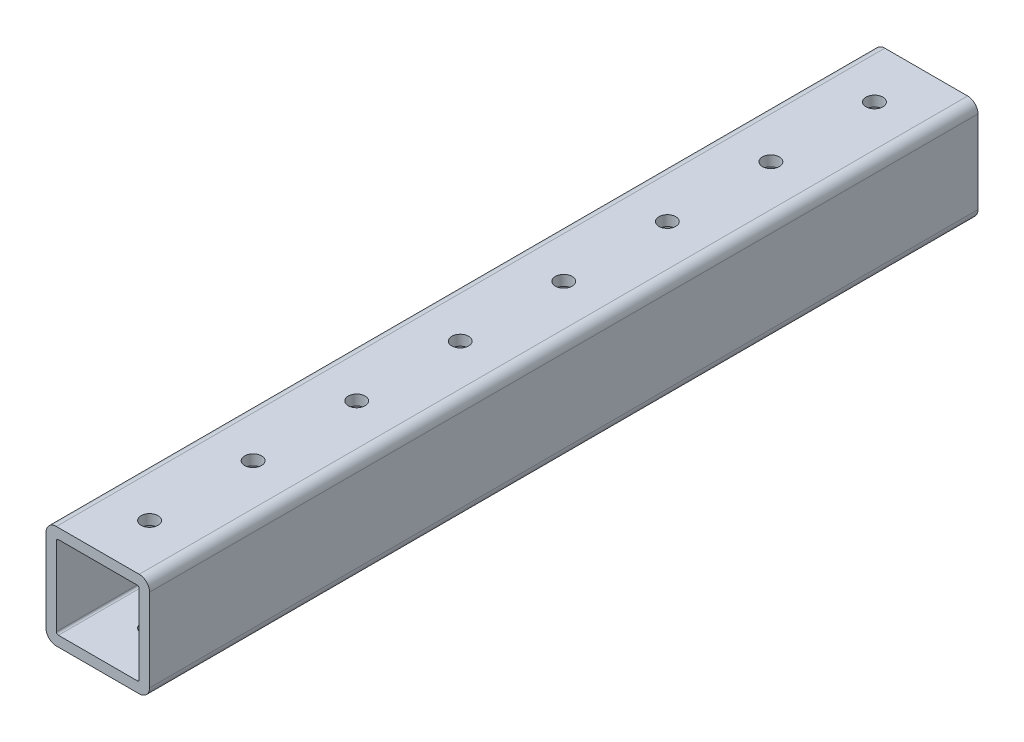
ISO-10303-21;
HEADER;
FILE_DESCRIPTION(('STEP AP214'),'2;1');
FILE_NAME('part.step','',(''),(''),'','','');
FILE_SCHEMA(('AUTOMOTIVE_DESIGN { 1 0 10303 214 1 1 1 1 }'));
ENDSEC;
DATA;
#1=APPLICATION_CONTEXT('core data for automotive mechanical design processes');
#2=APPLICATION_PROTOCOL_DEFINITION('international standard','automotive_design',2000,#1);
#3=PRODUCT_CONTEXT('',#1,'mechanical');
#4=PRODUCT('Part','Part','',(#3));
#5=PRODUCT_RELATED_PRODUCT_CATEGORY('part','',(#4));
#6=PRODUCT_DEFINITION_FORMATION('','',#4);
#7=PRODUCT_DEFINITION_CONTEXT('part definition',#1,'design');
#8=PRODUCT_DEFINITION('design','',#6,#7);
#9=PRODUCT_DEFINITION_SHAPE('','',#8);
#10=(LENGTH_UNIT() NAMED_UNIT(*) SI_UNIT(.MILLI.,.METRE.));
#11=(NAMED_UNIT(*) PLANE_ANGLE_UNIT() SI_UNIT($,.RADIAN.));
#12=(NAMED_UNIT(*) SI_UNIT($,.STERADIAN.) SOLID_ANGLE_UNIT());
#13=UNCERTAINTY_MEASURE_WITH_UNIT(LENGTH_MEASURE(1.E-05),#10,'distance_accuracy_value','');
#14=(GEOMETRIC_REPRESENTATION_CONTEXT(3) GLOBAL_UNCERTAINTY_ASSIGNED_CONTEXT((#13)) GLOBAL_UNIT_ASSIGNED_CONTEXT((#10,
#11,#12)) REPRESENTATION_CONTEXT('',''));
#15=CARTESIAN_POINT('',(0.,0.,0.));
#16=DIRECTION('',(0.,0.,1.));
#17=DIRECTION('',(1.,0.,0.));
#18=AXIS2_PLACEMENT_3D('',#15,#16,#17);
#19=CARTESIAN_POINT('',(-9.65999999999999,9.66,749.3));
#20=DIRECTION('',(0.,0.,1.));
#21=DIRECTION('',(1.,0.,0.));
#22=AXIS2_PLACEMENT_3D('',#19,#20,#21);
#23=CYLINDRICAL_SURFACE('',#22,0.5);
#24=DIRECTION('',(0.,0.,-1.));
#25=VECTOR('',#24,1.);
#26=CARTESIAN_POINT('',(-10.16,9.66,749.3));
#27=LINE('',#26,#25);
#28=CARTESIAN_POINT('',(-10.16,9.66,546.1));
#29=VERTEX_POINT('',#28);
#30=CARTESIAN_POINT('',(-10.16,9.66,749.3));
#31=VERTEX_POINT('',#30);
#32=EDGE_CURVE('E192',#29,#31,#27,.F.);
#33=ORIENTED_EDGE('',*,*,#32,.F.);
#34=CARTESIAN_POINT('',(-9.65999999999999,9.66,546.1));
#35=DIRECTION('',(0.,0.,1.));
#36=DIRECTION('',(1.,0.,0.));
#37=AXIS2_PLACEMENT_3D('',#34,#35,#36);
#38=CIRCLE('',#37,0.5);
#39=CARTESIAN_POINT('',(-9.65999999999999,10.16,546.1));
#40=VERTEX_POINT('',#39);
#41=EDGE_CURVE('E334',#29,#40,#38,.F.);
#42=ORIENTED_EDGE('',*,*,#41,.T.);
#43=DIRECTION('',(0.,0.,-1.));
#44=VECTOR('',#43,1.);
#45=CARTESIAN_POINT('',(-9.65999999999999,10.16,749.3));
#46=LINE('',#45,#44);
#47=CARTESIAN_POINT('',(-9.65999999999999,10.16,749.3));
#48=VERTEX_POINT('',#47);
#49=EDGE_CURVE('E270',#48,#40,#46,.T.);
#50=ORIENTED_EDGE('',*,*,#49,.F.);
#51=CARTESIAN_POINT('',(-9.65999999999999,9.66,749.3));
#52=DIRECTION('',(0.,0.,1.));
#53=DIRECTION('',(1.,0.,0.));
#54=AXIS2_PLACEMENT_3D('',#51,#52,#53);
#55=CIRCLE('',#54,0.5);
#56=EDGE_CURVE('E329',#31,#48,#55,.F.);
#57=ORIENTED_EDGE('',*,*,#56,.F.);
#58=EDGE_LOOP('',(#33,#42,#50,#57));
#59=FACE_BOUND('',#58,.T.);
#60=ADVANCED_FACE('F32',(#59),#23,.F.);
#61=CARTESIAN_POINT('',(0.,-12.7,558.8));
#62=DIRECTION('',(0.,1.,0.));
#63=DIRECTION('',(0.,0.,1.));
#64=AXIS2_PLACEMENT_3D('',#61,#62,#63);
#65=CYLINDRICAL_SURFACE('',#64,2.07009999999996);
#66=CARTESIAN_POINT('',(0.,10.16,558.8));
#67=DIRECTION('',(0.,1.,0.));
#68=DIRECTION('',(0.,0.,1.));
#69=AXIS2_PLACEMENT_3D('',#66,#67,#68);
#70=CIRCLE('',#69,2.07009999999996);
#71=CARTESIAN_POINT('',(0.,10.16,560.8701));
#72=VERTEX_POINT('',#71);
#73=EDGE_CURVE('E267',#72,#72,#70,.T.);
#74=ORIENTED_EDGE('',*,*,#73,.F.);
#75=EDGE_LOOP('',(#74));
#76=FACE_BOUND('',#75,.T.);
#77=CARTESIAN_POINT('',(0.,12.7,558.8));
#78=DIRECTION('',(0.,1.,0.));
#79=DIRECTION('',(0.,0.,1.));
#80=AXIS2_PLACEMENT_3D('',#77,#78,#79);
#81=CIRCLE('',#80,2.07009999999996);
#82=CARTESIAN_POINT('',(0.,12.7,560.8701));
#83=VERTEX_POINT('',#82);
#84=EDGE_CURVE('E321',#83,#83,#81,.T.);
#85=ORIENTED_EDGE('',*,*,#84,.T.);
#86=EDGE_LOOP('',(#85));
#87=FACE_BOUND('',#86,.T.);
#88=ADVANCED_FACE('F408',(#76,#87),#65,.F.);
#89=CARTESIAN_POINT('',(0.,-12.7,584.2));
#90=DIRECTION('',(0.,1.,0.));
#91=DIRECTION('',(0.,0.,1.));
#92=AXIS2_PLACEMENT_3D('',#89,#90,#91);
#93=CYLINDRICAL_SURFACE('',#92,2.07009999999996);
#94=CARTESIAN_POINT('',(0.,10.16,584.2));
#95=DIRECTION('',(0.,1.,0.));
#96=DIRECTION('',(0.,0.,1.));
#97=AXIS2_PLACEMENT_3D('',#94,#95,#96);
#98=CIRCLE('',#97,2.07009999999996);
#99=CARTESIAN_POINT('',(0.,10.16,586.2701));
#100=VERTEX_POINT('',#99);
#101=EDGE_CURVE('E264',#100,#100,#98,.T.);
#102=ORIENTED_EDGE('',*,*,#101,.F.);
#103=EDGE_LOOP('',(#102));
#104=FACE_BOUND('',#103,.T.);
#105=CARTESIAN_POINT('',(0.,12.7,584.2));
#106=DIRECTION('',(0.,1.,0.));
#107=DIRECTION('',(0.,0.,1.));
#108=AXIS2_PLACEMENT_3D('',#105,#106,#107);
#109=CIRCLE('',#108,2.07009999999996);
#110=CARTESIAN_POINT('',(0.,12.7,586.2701));
#111=VERTEX_POINT('',#110);
#112=EDGE_CURVE('E318',#111,#111,#109,.T.);
#113=ORIENTED_EDGE('',*,*,#112,.T.);
#114=EDGE_LOOP('',(#113));
#115=FACE_BOUND('',#114,.T.);
#116=ADVANCED_FACE('F413',(#104,#115),#93,.F.);
#117=CARTESIAN_POINT('',(0.,-12.7,609.6));
#118=DIRECTION('',(0.,1.,0.));
#119=DIRECTION('',(0.,0.,1.));
#120=AXIS2_PLACEMENT_3D('',#117,#118,#119);
#121=CYLINDRICAL_SURFACE('',#120,2.07009999999996);
#122=CARTESIAN_POINT('',(0.,10.16,609.6));
#123=DIRECTION('',(0.,1.,0.));
#124=DIRECTION('',(0.,0.,1.));
#125=AXIS2_PLACEMENT_3D('',#122,#123,#124);
#126=CIRCLE('',#125,2.07009999999996);
#127=CARTESIAN_POINT('',(0.,10.16,611.6701));
#128=VERTEX_POINT('',#127);
#129=EDGE_CURVE('E261',#128,#128,#126,.T.);
#130=ORIENTED_EDGE('',*,*,#129,.F.);
#131=EDGE_LOOP('',(#130));
#132=FACE_BOUND('',#131,.T.);
#133=CARTESIAN_POINT('',(0.,12.7,609.6));
#134=DIRECTION('',(0.,1.,0.));
#135=DIRECTION('',(0.,0.,1.));
#136=AXIS2_PLACEMENT_3D('',#133,#134,#135);
#137=CIRCLE('',#136,2.07009999999996);
#138=CARTESIAN_POINT('',(0.,12.7,611.6701));
#139=VERTEX_POINT('',#138);
#140=EDGE_CURVE('E315',#139,#139,#137,.T.);
#141=ORIENTED_EDGE('',*,*,#140,.T.);
#142=EDGE_LOOP('',(#141));
#143=FACE_BOUND('',#142,.T.);
#144=ADVANCED_FACE('F534',(#132,#143),#121,.F.);
#145=CARTESIAN_POINT('',(0.,-12.7,635.));
#146=DIRECTION('',(0.,1.,0.));
#147=DIRECTION('',(0.,0.,1.));
#148=AXIS2_PLACEMENT_3D('',#145,#146,#147);
#149=CYLINDRICAL_SURFACE('',#148,2.07009999999996);
#150=CARTESIAN_POINT('',(0.,10.16,635.));
#151=DIRECTION('',(0.,1.,0.));
#152=DIRECTION('',(0.,0.,1.));
#153=AXIS2_PLACEMENT_3D('',#150,#151,#152);
#154=CIRCLE('',#153,2.07009999999996);
#155=CARTESIAN_POINT('',(0.,10.16,637.0701));
#156=VERTEX_POINT('',#155);
#157=EDGE_CURVE('E258',#156,#156,#154,.T.);
#158=ORIENTED_EDGE('',*,*,#157,.F.);
#159=EDGE_LOOP('',(#158));
#160=FACE_BOUND('',#159,.T.);
#161=CARTESIAN_POINT('',(0.,12.7,635.));
#162=DIRECTION('',(0.,1.,0.));
#163=DIRECTION('',(0.,0.,1.));
#164=AXIS2_PLACEMENT_3D('',#161,#162,#163);
#165=CIRCLE('',#164,2.07009999999996);
#166=CARTESIAN_POINT('',(0.,12.7,637.0701));
#167=VERTEX_POINT('',#166);
#168=EDGE_CURVE('E312',#167,#167,#165,.T.);
#169=ORIENTED_EDGE('',*,*,#168,.T.);
#170=EDGE_LOOP('',(#169));
#171=FACE_BOUND('',#170,.T.);
#172=ADVANCED_FACE('F530',(#160,#171),#149,.F.);
#173=CARTESIAN_POINT('',(0.,-12.7,660.4));
#174=DIRECTION('',(0.,1.,0.));
#175=DIRECTION('',(0.,0.,1.));
#176=AXIS2_PLACEMENT_3D('',#173,#174,#175);
#177=CYLINDRICAL_SURFACE('',#176,2.07009999999996);
#178=CARTESIAN_POINT('',(0.,10.16,660.4));
#179=DIRECTION('',(0.,1.,0.));
#180=DIRECTION('',(0.,0.,1.));
#181=AXIS2_PLACEMENT_3D('',#178,#179,#180);
#182=CIRCLE('',#181,2.07009999999996);
#183=CARTESIAN_POINT('',(0.,10.16,662.4701));
#184=VERTEX_POINT('',#183);
#185=EDGE_CURVE('E255',#184,#184,#182,.T.);
#186=ORIENTED_EDGE('',*,*,#185,.F.);
#187=EDGE_LOOP('',(#186));
#188=FACE_BOUND('',#187,.T.);
#189=CARTESIAN_POINT('',(0.,12.7,660.4));
#190=DIRECTION('',(0.,1.,0.));
#191=DIRECTION('',(0.,0.,1.));
#192=AXIS2_PLACEMENT_3D('',#189,#190,#191);
#193=CIRCLE('',#192,2.07009999999996);
#194=CARTESIAN_POINT('',(0.,12.7,662.4701));
#195=VERTEX_POINT('',#194);
#196=EDGE_CURVE('E309',#195,#195,#193,.T.);
#197=ORIENTED_EDGE('',*,*,#196,.T.);
#198=EDGE_LOOP('',(#197));
#199=FACE_BOUND('',#198,.T.);
#200=ADVANCED_FACE('F526',(#188,#199),#177,.F.);
#201=CARTESIAN_POINT('',(0.,-12.7,685.8));
#202=DIRECTION('',(0.,1.,0.));
#203=DIRECTION('',(0.,0.,1.));
#204=AXIS2_PLACEMENT_3D('',#201,#202,#203);
#205=CYLINDRICAL_SURFACE('',#204,2.07009999999996);
#206=CARTESIAN_POINT('',(0.,10.16,685.8));
#207=DIRECTION('',(0.,1.,0.));
#208=DIRECTION('',(0.,0.,1.));
#209=AXIS2_PLACEMENT_3D('',#206,#207,#208);
#210=CIRCLE('',#209,2.07009999999996);
#211=CARTESIAN_POINT('',(0.,10.16,687.8701));
#212=VERTEX_POINT('',#211);
#213=EDGE_CURVE('E252',#212,#212,#210,.T.);
#214=ORIENTED_EDGE('',*,*,#213,.F.);
#215=EDGE_LOOP('',(#214));
#216=FACE_BOUND('',#215,.T.);
#217=CARTESIAN_POINT('',(0.,12.7,685.8));
#218=DIRECTION('',(0.,1.,0.));
#219=DIRECTION('',(0.,0.,1.));
#220=AXIS2_PLACEMENT_3D('',#217,#218,#219);
#221=CIRCLE('',#220,2.07009999999996);
#222=CARTESIAN_POINT('',(0.,12.7,687.8701));
#223=VERTEX_POINT('',#222);
#224=EDGE_CURVE('E306',#223,#223,#221,.T.);
#225=ORIENTED_EDGE('',*,*,#224,.T.);
#226=EDGE_LOOP('',(#225));
#227=FACE_BOUND('',#226,.T.);
#228=ADVANCED_FACE('F522',(#216,#227),#205,.F.);
#229=CARTESIAN_POINT('',(0.,-12.7,711.2));
#230=DIRECTION('',(0.,1.,0.));
#231=DIRECTION('',(0.,0.,1.));
#232=AXIS2_PLACEMENT_3D('',#229,#230,#231);
#233=CYLINDRICAL_SURFACE('',#232,2.07009999999996);
#234=CARTESIAN_POINT('',(0.,10.16,711.2));
#235=DIRECTION('',(0.,1.,0.));
#236=DIRECTION('',(0.,0.,1.));
#237=AXIS2_PLACEMENT_3D('',#234,#235,#236);
#238=CIRCLE('',#237,2.07009999999996);
#239=CARTESIAN_POINT('',(0.,10.16,713.2701));
#240=VERTEX_POINT('',#239);
#241=EDGE_CURVE('E249',#240,#240,#238,.T.);
#242=ORIENTED_EDGE('',*,*,#241,.F.);
#243=EDGE_LOOP('',(#242));
#244=FACE_BOUND('',#243,.T.);
#245=CARTESIAN_POINT('',(0.,12.7,711.2));
#246=DIRECTION('',(0.,1.,0.));
#247=DIRECTION('',(0.,0.,1.));
#248=AXIS2_PLACEMENT_3D('',#245,#246,#247);
#249=CIRCLE('',#248,2.07009999999996);
#250=CARTESIAN_POINT('',(0.,12.7,713.2701));
#251=VERTEX_POINT('',#250);
#252=EDGE_CURVE('E303',#251,#251,#249,.T.);
#253=ORIENTED_EDGE('',*,*,#252,.T.);
#254=EDGE_LOOP('',(#253));
#255=FACE_BOUND('',#254,.T.);
#256=ADVANCED_FACE('F518',(#244,#255),#233,.F.);
#257=CARTESIAN_POINT('',(0.,-12.7,736.6));
#258=DIRECTION('',(0.,1.,0.));
#259=DIRECTION('',(0.,0.,1.));
#260=AXIS2_PLACEMENT_3D('',#257,#258,#259);
#261=CYLINDRICAL_SURFACE('',#260,2.07009999999996);
#262=CARTESIAN_POINT('',(0.,10.16,736.6));
#263=DIRECTION('',(0.,1.,0.));
#264=DIRECTION('',(0.,0.,1.));
#265=AXIS2_PLACEMENT_3D('',#262,#263,#264);
#266=CIRCLE('',#265,2.07009999999996);
#267=CARTESIAN_POINT('',(0.,10.16,738.6701));
#268=VERTEX_POINT('',#267);
#269=EDGE_CURVE('E185',#268,#268,#266,.T.);
#270=ORIENTED_EDGE('',*,*,#269,.F.);
#271=EDGE_LOOP('',(#270));
#272=FACE_BOUND('',#271,.T.);
#273=CARTESIAN_POINT('',(0.,12.7,736.6));
#274=DIRECTION('',(0.,1.,0.));
#275=DIRECTION('',(0.,0.,1.));
#276=AXIS2_PLACEMENT_3D('',#273,#274,#275);
#277=CIRCLE('',#276,2.07009999999996);
#278=CARTESIAN_POINT('',(0.,12.7,738.6701));
#279=VERTEX_POINT('',#278);
#280=EDGE_CURVE('E300',#279,#279,#277,.T.);
#281=ORIENTED_EDGE('',*,*,#280,.T.);
#282=EDGE_LOOP('',(#281));
#283=FACE_BOUND('',#282,.T.);
#284=ADVANCED_FACE('F515',(#272,#283),#261,.F.);
#285=CARTESIAN_POINT('',(9.66,9.65999999999999,749.3));
#286=DIRECTION('',(0.,0.,1.));
#287=DIRECTION('',(1.,0.,0.));
#288=AXIS2_PLACEMENT_3D('',#285,#286,#287);
#289=CYLINDRICAL_SURFACE('',#288,0.5);
#290=DIRECTION('',(0.,0.,-1.));
#291=VECTOR('',#290,1.);
#292=CARTESIAN_POINT('',(9.66,10.16,749.3));
#293=LINE('',#292,#291);
#294=CARTESIAN_POINT('',(9.66,10.16,546.1));
#295=VERTEX_POINT('',#294);
#296=CARTESIAN_POINT('',(9.66,10.16,749.3));
#297=VERTEX_POINT('',#296);
#298=EDGE_CURVE('E191',#295,#297,#293,.F.);
#299=ORIENTED_EDGE('',*,*,#298,.F.);
#300=CARTESIAN_POINT('',(9.66,9.65999999999999,546.1));
#301=DIRECTION('',(0.,0.,1.));
#302=DIRECTION('',(1.,0.,0.));
#303=AXIS2_PLACEMENT_3D('',#300,#301,#302);
#304=CIRCLE('',#303,0.5);
#305=CARTESIAN_POINT('',(10.16,9.65999999999999,546.1));
#306=VERTEX_POINT('',#305);
#307=EDGE_CURVE('E337',#295,#306,#304,.F.);
#308=ORIENTED_EDGE('',*,*,#307,.T.);
#309=DIRECTION('',(0.,0.,1.));
#310=VECTOR('',#309,1.);
#311=CARTESIAN_POINT('',(10.16,9.65999999999999,749.3));
#312=LINE('',#311,#310);
#313=CARTESIAN_POINT('',(10.16,9.65999999999999,749.3));
#314=VERTEX_POINT('',#313);
#315=EDGE_CURVE('E181',#314,#306,#312,.F.);
#316=ORIENTED_EDGE('',*,*,#315,.F.);
#317=CARTESIAN_POINT('',(9.66,9.65999999999999,749.3));
#318=DIRECTION('',(0.,0.,1.));
#319=DIRECTION('',(1.,0.,0.));
#320=AXIS2_PLACEMENT_3D('',#317,#318,#319);
#321=CIRCLE('',#320,0.5);
#322=EDGE_CURVE('E328',#297,#314,#321,.F.);
#323=ORIENTED_EDGE('',*,*,#322,.F.);
#324=EDGE_LOOP('',(#299,#308,#316,#323));
#325=FACE_BOUND('',#324,.T.);
#326=ADVANCED_FACE('F440',(#325),#289,.F.);
#327=CARTESIAN_POINT('',(-9.65999999999999,-9.66,749.3));
#328=DIRECTION('',(0.,0.,1.));
#329=DIRECTION('',(1.,0.,0.));
#330=AXIS2_PLACEMENT_3D('',#327,#328,#329);
#331=CYLINDRICAL_SURFACE('',#330,0.5);
#332=DIRECTION('',(0.,0.,1.));
#333=VECTOR('',#332,1.);
#334=CARTESIAN_POINT('',(-9.65999999999999,-10.16,749.3));
#335=LINE('',#334,#333);
#336=CARTESIAN_POINT('',(-9.65999999999999,-10.16,546.1));
#337=VERTEX_POINT('',#336);
#338=CARTESIAN_POINT('',(-9.65999999999999,-10.16,749.3));
#339=VERTEX_POINT('',#338);
#340=EDGE_CURVE('E187',#337,#339,#335,.T.);
#341=ORIENTED_EDGE('',*,*,#340,.F.);
#342=CARTESIAN_POINT('',(-9.65999999999999,-9.66,546.1));
#343=DIRECTION('',(0.,0.,1.));
#344=DIRECTION('',(1.,0.,0.));
#345=AXIS2_PLACEMENT_3D('',#342,#343,#344);
#346=CIRCLE('',#345,0.5);
#347=CARTESIAN_POINT('',(-10.16,-9.66,546.1));
#348=VERTEX_POINT('',#347);
#349=EDGE_CURVE('E46',#337,#348,#346,.F.);
#350=ORIENTED_EDGE('',*,*,#349,.T.);
#351=DIRECTION('',(0.,0.,-1.));
#352=VECTOR('',#351,1.);
#353=CARTESIAN_POINT('',(-10.16,-9.66,749.3));
#354=LINE('',#353,#352);
#355=CARTESIAN_POINT('',(-10.16,-9.66,749.3));
#356=VERTEX_POINT('',#355);
#357=EDGE_CURVE('E188',#356,#348,#354,.T.);
#358=ORIENTED_EDGE('',*,*,#357,.F.);
#359=CARTESIAN_POINT('',(-9.65999999999999,-9.66,749.3));
#360=DIRECTION('',(0.,0.,1.));
#361=DIRECTION('',(1.,0.,0.));
#362=AXIS2_PLACEMENT_3D('',#359,#360,#361);
#363=CIRCLE('',#362,0.5);
#364=EDGE_CURVE('E326',#339,#356,#363,.F.);
#365=ORIENTED_EDGE('',*,*,#364,.F.);
#366=EDGE_LOOP('',(#341,#350,#358,#365));
#367=FACE_BOUND('',#366,.T.);
#368=ADVANCED_FACE('F423',(#367),#331,.F.);
#369=CARTESIAN_POINT('',(9.66,-9.66,749.3));
#370=DIRECTION('',(0.,0.,1.));
#371=DIRECTION('',(1.,0.,0.));
#372=AXIS2_PLACEMENT_3D('',#369,#370,#371);
#373=CYLINDRICAL_SURFACE('',#372,0.5);
#374=DIRECTION('',(0.,0.,1.));
#375=VECTOR('',#374,1.);
#376=CARTESIAN_POINT('',(10.16,-9.66,749.3));
#377=LINE('',#376,#375);
#378=CARTESIAN_POINT('',(10.16,-9.66,546.1));
#379=VERTEX_POINT('',#378);
#380=CARTESIAN_POINT('',(10.16,-9.66,749.3));
#381=VERTEX_POINT('',#380);
#382=EDGE_CURVE('E184',#379,#381,#377,.T.);
#383=ORIENTED_EDGE('',*,*,#382,.F.);
#384=CARTESIAN_POINT('',(9.66,-9.66,546.1));
#385=DIRECTION('',(0.,0.,1.));
#386=DIRECTION('',(1.,0.,0.));
#387=AXIS2_PLACEMENT_3D('',#384,#385,#386);
#388=CIRCLE('',#387,0.5);
#389=CARTESIAN_POINT('',(9.66,-10.16,546.1));
#390=VERTEX_POINT('',#389);
#391=EDGE_CURVE('E347',#379,#390,#388,.F.);
#392=ORIENTED_EDGE('',*,*,#391,.T.);
#393=DIRECTION('',(0.,0.,1.));
#394=VECTOR('',#393,1.);
#395=CARTESIAN_POINT('',(9.66,-10.16,749.3));
#396=LINE('',#395,#394);
#397=CARTESIAN_POINT('',(9.66,-10.16,749.3));
#398=VERTEX_POINT('',#397);
#399=EDGE_CURVE('E243',#398,#390,#396,.F.);
#400=ORIENTED_EDGE('',*,*,#399,.F.);
#401=CARTESIAN_POINT('',(9.66,-9.66,749.3));
#402=DIRECTION('',(0.,0.,1.));
#403=DIRECTION('',(1.,0.,0.));
#404=AXIS2_PLACEMENT_3D('',#401,#402,#403);
#405=CIRCLE('',#404,0.5);
#406=EDGE_CURVE('E324',#381,#398,#405,.F.);
#407=ORIENTED_EDGE('',*,*,#406,.F.);
#408=EDGE_LOOP('',(#383,#392,#400,#407));
#409=FACE_BOUND('',#408,.T.);
#410=ADVANCED_FACE('F432',(#409),#373,.F.);
#411=CARTESIAN_POINT('',(0.,-12.7,558.8));
#412=DIRECTION('',(0.,1.,0.));
#413=DIRECTION('',(0.,0.,1.));
#414=AXIS2_PLACEMENT_3D('',#411,#412,#413);
#415=CYLINDRICAL_SURFACE('',#414,2.07009999999996);
#416=CARTESIAN_POINT('',(0.,-10.16,558.8));
#417=DIRECTION('',(0.,1.,0.));
#418=DIRECTION('',(0.,0.,1.));
#419=AXIS2_PLACEMENT_3D('',#416,#417,#418);
#420=CIRCLE('',#419,2.07009999999996);
#421=CARTESIAN_POINT('',(0.,-10.16,560.8701));
#422=VERTEX_POINT('',#421);
#423=EDGE_CURVE('E240',#422,#422,#420,.F.);
#424=ORIENTED_EDGE('',*,*,#423,.F.);
#425=EDGE_LOOP('',(#424));
#426=FACE_BOUND('',#425,.T.);
#427=CARTESIAN_POINT('',(0.,-12.7,558.8));
#428=DIRECTION('',(0.,1.,0.));
#429=DIRECTION('',(0.,0.,1.));
#430=AXIS2_PLACEMENT_3D('',#427,#428,#429);
#431=CIRCLE('',#430,2.07009999999996);
#432=CARTESIAN_POINT('',(0.,-12.7,560.8701));
#433=VERTEX_POINT('',#432);
#434=EDGE_CURVE('E294',#433,#433,#431,.F.);
#435=ORIENTED_EDGE('',*,*,#434,.T.);
#436=EDGE_LOOP('',(#435));
#437=FACE_BOUND('',#436,.T.);
#438=ADVANCED_FACE('F504',(#426,#437),#415,.F.);
#439=CARTESIAN_POINT('',(0.,-12.7,584.2));
#440=DIRECTION('',(0.,1.,0.));
#441=DIRECTION('',(0.,0.,1.));
#442=AXIS2_PLACEMENT_3D('',#439,#440,#441);
#443=CYLINDRICAL_SURFACE('',#442,2.07009999999996);
#444=CARTESIAN_POINT('',(0.,-10.16,584.2));
#445=DIRECTION('',(0.,1.,0.));
#446=DIRECTION('',(0.,0.,1.));
#447=AXIS2_PLACEMENT_3D('',#444,#445,#446);
#448=CIRCLE('',#447,2.07009999999996);
#449=CARTESIAN_POINT('',(0.,-10.16,586.2701));
#450=VERTEX_POINT('',#449);
#451=EDGE_CURVE('E237',#450,#450,#448,.F.);
#452=ORIENTED_EDGE('',*,*,#451,.F.);
#453=EDGE_LOOP('',(#452));
#454=FACE_BOUND('',#453,.T.);
#455=CARTESIAN_POINT('',(0.,-12.7,584.2));
#456=DIRECTION('',(0.,1.,0.));
#457=DIRECTION('',(0.,0.,1.));
#458=AXIS2_PLACEMENT_3D('',#455,#456,#457);
#459=CIRCLE('',#458,2.07009999999996);
#460=CARTESIAN_POINT('',(0.,-12.7,586.2701));
#461=VERTEX_POINT('',#460);
#462=EDGE_CURVE('E291',#461,#461,#459,.F.);
#463=ORIENTED_EDGE('',*,*,#462,.T.);
#464=EDGE_LOOP('',(#463));
#465=FACE_BOUND('',#464,.T.);
#466=ADVANCED_FACE('F500',(#454,#465),#443,.F.);
#467=CARTESIAN_POINT('',(0.,-12.7,609.6));
#468=DIRECTION('',(0.,1.,0.));
#469=DIRECTION('',(0.,0.,1.));
#470=AXIS2_PLACEMENT_3D('',#467,#468,#469);
#471=CYLINDRICAL_SURFACE('',#470,2.07009999999996);
#472=CARTESIAN_POINT('',(0.,-10.16,609.6));
#473=DIRECTION('',(0.,1.,0.));
#474=DIRECTION('',(0.,0.,1.));
#475=AXIS2_PLACEMENT_3D('',#472,#473,#474);
#476=CIRCLE('',#475,2.07009999999996);
#477=CARTESIAN_POINT('',(0.,-10.16,611.6701));
#478=VERTEX_POINT('',#477);
#479=EDGE_CURVE('E234',#478,#478,#476,.F.);
#480=ORIENTED_EDGE('',*,*,#479,.F.);
#481=EDGE_LOOP('',(#480));
#482=FACE_BOUND('',#481,.T.);
#483=CARTESIAN_POINT('',(0.,-12.7,609.6));
#484=DIRECTION('',(0.,1.,0.));
#485=DIRECTION('',(0.,0.,1.));
#486=AXIS2_PLACEMENT_3D('',#483,#484,#485);
#487=CIRCLE('',#486,2.07009999999996);
#488=CARTESIAN_POINT('',(0.,-12.7,611.6701));
#489=VERTEX_POINT('',#488);
#490=EDGE_CURVE('E288',#489,#489,#487,.F.);
#491=ORIENTED_EDGE('',*,*,#490,.T.);
#492=EDGE_LOOP('',(#491));
#493=FACE_BOUND('',#492,.T.);
#494=ADVANCED_FACE('F496',(#482,#493),#471,.F.);
#495=CARTESIAN_POINT('',(0.,-12.7,635.));
#496=DIRECTION('',(0.,1.,0.));
#497=DIRECTION('',(0.,0.,1.));
#498=AXIS2_PLACEMENT_3D('',#495,#496,#497);
#499=CYLINDRICAL_SURFACE('',#498,2.07009999999996);
#500=CARTESIAN_POINT('',(0.,-10.16,635.));
#501=DIRECTION('',(0.,1.,0.));
#502=DIRECTION('',(0.,0.,1.));
#503=AXIS2_PLACEMENT_3D('',#500,#501,#502);
#504=CIRCLE('',#503,2.07009999999996);
#505=CARTESIAN_POINT('',(0.,-10.16,637.0701));
#506=VERTEX_POINT('',#505);
#507=EDGE_CURVE('E231',#506,#506,#504,.F.);
#508=ORIENTED_EDGE('',*,*,#507,.F.);
#509=EDGE_LOOP('',(#508));
#510=FACE_BOUND('',#509,.T.);
#511=CARTESIAN_POINT('',(0.,-12.7,635.));
#512=DIRECTION('',(0.,1.,0.));
#513=DIRECTION('',(0.,0.,1.));
#514=AXIS2_PLACEMENT_3D('',#511,#512,#513);
#515=CIRCLE('',#514,2.07009999999996);
#516=CARTESIAN_POINT('',(0.,-12.7,637.0701));
#517=VERTEX_POINT('',#516);
#518=EDGE_CURVE('E285',#517,#517,#515,.F.);
#519=ORIENTED_EDGE('',*,*,#518,.T.);
#520=EDGE_LOOP('',(#519));
#521=FACE_BOUND('',#520,.T.);
#522=ADVANCED_FACE('F492',(#510,#521),#499,.F.);
#523=CARTESIAN_POINT('',(0.,-12.7,660.4));
#524=DIRECTION('',(0.,1.,0.));
#525=DIRECTION('',(0.,0.,1.));
#526=AXIS2_PLACEMENT_3D('',#523,#524,#525);
#527=CYLINDRICAL_SURFACE('',#526,2.07009999999996);
#528=CARTESIAN_POINT('',(0.,-10.16,660.4));
#529=DIRECTION('',(0.,1.,0.));
#530=DIRECTION('',(0.,0.,1.));
#531=AXIS2_PLACEMENT_3D('',#528,#529,#530);
#532=CIRCLE('',#531,2.07009999999996);
#533=CARTESIAN_POINT('',(0.,-10.16,662.4701));
#534=VERTEX_POINT('',#533);
#535=EDGE_CURVE('E228',#534,#534,#532,.F.);
#536=ORIENTED_EDGE('',*,*,#535,.F.);
#537=EDGE_LOOP('',(#536));
#538=FACE_BOUND('',#537,.T.);
#539=CARTESIAN_POINT('',(0.,-12.7,660.4));
#540=DIRECTION('',(0.,1.,0.));
#541=DIRECTION('',(0.,0.,1.));
#542=AXIS2_PLACEMENT_3D('',#539,#540,#541);
#543=CIRCLE('',#542,2.07009999999996);
#544=CARTESIAN_POINT('',(0.,-12.7,662.4701));
#545=VERTEX_POINT('',#544);
#546=EDGE_CURVE('E282',#545,#545,#543,.F.);
#547=ORIENTED_EDGE('',*,*,#546,.T.);
#548=EDGE_LOOP('',(#547));
#549=FACE_BOUND('',#548,.T.);
#550=ADVANCED_FACE('F488',(#538,#549),#527,.F.);
#551=CARTESIAN_POINT('',(0.,-12.7,685.8));
#552=DIRECTION('',(0.,1.,0.));
#553=DIRECTION('',(0.,0.,1.));
#554=AXIS2_PLACEMENT_3D('',#551,#552,#553);
#555=CYLINDRICAL_SURFACE('',#554,2.07009999999996);
#556=CARTESIAN_POINT('',(0.,-10.16,685.8));
#557=DIRECTION('',(0.,1.,0.));
#558=DIRECTION('',(0.,0.,1.));
#559=AXIS2_PLACEMENT_3D('',#556,#557,#558);
#560=CIRCLE('',#559,2.07009999999996);
#561=CARTESIAN_POINT('',(0.,-10.16,687.8701));
#562=VERTEX_POINT('',#561);
#563=EDGE_CURVE('E225',#562,#562,#560,.F.);
#564=ORIENTED_EDGE('',*,*,#563,.F.);
#565=EDGE_LOOP('',(#564));
#566=FACE_BOUND('',#565,.T.);
#567=CARTESIAN_POINT('',(0.,-12.7,685.8));
#568=DIRECTION('',(0.,1.,0.));
#569=DIRECTION('',(0.,0.,1.));
#570=AXIS2_PLACEMENT_3D('',#567,#568,#569);
#571=CIRCLE('',#570,2.07009999999996);
#572=CARTESIAN_POINT('',(0.,-12.7,687.8701));
#573=VERTEX_POINT('',#572);
#574=EDGE_CURVE('E279',#573,#573,#571,.F.);
#575=ORIENTED_EDGE('',*,*,#574,.T.);
#576=EDGE_LOOP('',(#575));
#577=FACE_BOUND('',#576,.T.);
#578=ADVANCED_FACE('F484',(#566,#577),#555,.F.);
#579=CARTESIAN_POINT('',(0.,-12.7,711.2));
#580=DIRECTION('',(0.,1.,0.));
#581=DIRECTION('',(0.,0.,1.));
#582=AXIS2_PLACEMENT_3D('',#579,#580,#581);
#583=CYLINDRICAL_SURFACE('',#582,2.07009999999996);
#584=CARTESIAN_POINT('',(0.,-10.16,711.2));
#585=DIRECTION('',(0.,1.,0.));
#586=DIRECTION('',(0.,0.,1.));
#587=AXIS2_PLACEMENT_3D('',#584,#585,#586);
#588=CIRCLE('',#587,2.07009999999996);
#589=CARTESIAN_POINT('',(0.,-10.16,713.2701));
#590=VERTEX_POINT('',#589);
#591=EDGE_CURVE('E222',#590,#590,#588,.F.);
#592=ORIENTED_EDGE('',*,*,#591,.F.);
#593=EDGE_LOOP('',(#592));
#594=FACE_BOUND('',#593,.T.);
#595=CARTESIAN_POINT('',(0.,-12.7,711.2));
#596=DIRECTION('',(0.,1.,0.));
#597=DIRECTION('',(0.,0.,1.));
#598=AXIS2_PLACEMENT_3D('',#595,#596,#597);
#599=CIRCLE('',#598,2.07009999999996);
#600=CARTESIAN_POINT('',(0.,-12.7,713.2701));
#601=VERTEX_POINT('',#600);
#602=EDGE_CURVE('E276',#601,#601,#599,.F.);
#603=ORIENTED_EDGE('',*,*,#602,.T.);
#604=EDGE_LOOP('',(#603));
#605=FACE_BOUND('',#604,.T.);
#606=ADVANCED_FACE('F475',(#594,#605),#583,.F.);
#607=CARTESIAN_POINT('',(0.,-12.7,736.6));
#608=DIRECTION('',(0.,1.,0.));
#609=DIRECTION('',(0.,0.,1.));
#610=AXIS2_PLACEMENT_3D('',#607,#608,#609);
#611=CYLINDRICAL_SURFACE('',#610,2.07009999999996);
#612=CARTESIAN_POINT('',(0.,-10.16,736.6));
#613=DIRECTION('',(0.,1.,0.));
#614=DIRECTION('',(0.,0.,1.));
#615=AXIS2_PLACEMENT_3D('',#612,#613,#614);
#616=CIRCLE('',#615,2.07009999999996);
#617=CARTESIAN_POINT('',(0.,-10.16,738.6701));
#618=VERTEX_POINT('',#617);
#619=EDGE_CURVE('E219',#618,#618,#616,.F.);
#620=ORIENTED_EDGE('',*,*,#619,.F.);
#621=EDGE_LOOP('',(#620));
#622=FACE_BOUND('',#621,.T.);
#623=CARTESIAN_POINT('',(0.,-12.7,736.6));
#624=DIRECTION('',(0.,1.,0.));
#625=DIRECTION('',(0.,0.,1.));
#626=AXIS2_PLACEMENT_3D('',#623,#624,#625);
#627=CIRCLE('',#626,2.07009999999996);
#628=CARTESIAN_POINT('',(0.,-12.7,738.6701));
#629=VERTEX_POINT('',#628);
#630=EDGE_CURVE('E194',#629,#629,#627,.F.);
#631=ORIENTED_EDGE('',*,*,#630,.T.);
#632=EDGE_LOOP('',(#631));
#633=FACE_BOUND('',#632,.T.);
#634=ADVANCED_FACE('F467',(#622,#633),#611,.F.);
#635=CARTESIAN_POINT('',(-10.16,12.7,749.3));
#636=DIRECTION('',(0.,-1.,0.));
#637=DIRECTION('',(0.,0.,-1.));
#638=AXIS2_PLACEMENT_3D('',#635,#636,#637);
#639=PLANE('',#638);
#640=ORIENTED_EDGE('',*,*,#280,.F.);
#641=EDGE_LOOP('',(#640));
#642=FACE_BOUND('',#641,.T.);
#643=ORIENTED_EDGE('',*,*,#252,.F.);
#644=EDGE_LOOP('',(#643));
#645=FACE_BOUND('',#644,.T.);
#646=ORIENTED_EDGE('',*,*,#224,.F.);
#647=EDGE_LOOP('',(#646));
#648=FACE_BOUND('',#647,.T.);
#649=ORIENTED_EDGE('',*,*,#196,.F.);
#650=EDGE_LOOP('',(#649));
#651=FACE_BOUND('',#650,.T.);
#652=ORIENTED_EDGE('',*,*,#168,.F.);
#653=EDGE_LOOP('',(#652));
#654=FACE_BOUND('',#653,.T.);
#655=ORIENTED_EDGE('',*,*,#140,.F.);
#656=EDGE_LOOP('',(#655));
#657=FACE_BOUND('',#656,.T.);
#658=ORIENTED_EDGE('',*,*,#112,.F.);
#659=EDGE_LOOP('',(#658));
#660=FACE_BOUND('',#659,.T.);
#661=ORIENTED_EDGE('',*,*,#84,.F.);
#662=EDGE_LOOP('',(#661));
#663=FACE_BOUND('',#662,.T.);
#664=DIRECTION('',(0.,0.,-1.));
#665=VECTOR('',#664,1.);
#666=CARTESIAN_POINT('',(10.16,12.7,749.3));
#667=LINE('',#666,#665);
#668=CARTESIAN_POINT('',(10.16,12.7,546.1));
#669=VERTEX_POINT('',#668);
#670=CARTESIAN_POINT('',(10.16,12.7,749.3));
#671=VERTEX_POINT('',#670);
#672=EDGE_CURVE('E164',#669,#671,#667,.F.);
#673=ORIENTED_EDGE('',*,*,#672,.F.);
#674=DIRECTION('',(-1.,0.,0.));
#675=VECTOR('',#674,1.);
#676=CARTESIAN_POINT('',(-10.16,12.7,546.1));
#677=LINE('',#676,#675);
#678=CARTESIAN_POINT('',(-10.16,12.7,546.1));
#679=VERTEX_POINT('',#678);
#680=EDGE_CURVE('E352',#669,#679,#677,.T.);
#681=ORIENTED_EDGE('',*,*,#680,.T.);
#682=DIRECTION('',(0.,0.,-1.));
#683=VECTOR('',#682,1.);
#684=CARTESIAN_POINT('',(-10.16,12.7,749.3));
#685=LINE('',#684,#683);
#686=CARTESIAN_POINT('',(-10.16,12.7,749.3));
#687=VERTEX_POINT('',#686);
#688=EDGE_CURVE('E200',#687,#679,#685,.T.);
#689=ORIENTED_EDGE('',*,*,#688,.F.);
#690=DIRECTION('',(1.,0.,0.));
#691=VECTOR('',#690,1.);
#692=CARTESIAN_POINT('',(10.16,12.7,749.3));
#693=LINE('',#692,#691);
#694=EDGE_CURVE('E214',#671,#687,#693,.F.);
#695=ORIENTED_EDGE('',*,*,#694,.F.);
#696=EDGE_LOOP('',(#673,#681,#689,#695));
#697=FACE_BOUND('',#696,.T.);
#698=ADVANCED_FACE('F384',(#642,#645,#648,#651,#654,#657,#660,#663,#697),#639,.F.);
#699=CARTESIAN_POINT('',(-10.16,10.16,749.3));
#700=DIRECTION('',(0.,0.,-1.));
#701=DIRECTION('',(-1.,0.,0.));
#702=AXIS2_PLACEMENT_3D('',#699,#700,#701);
#703=CYLINDRICAL_SURFACE('',#702,2.54);
#704=CARTESIAN_POINT('',(-10.16,10.16,546.1));
#705=DIRECTION('',(0.,0.,1.));
#706=DIRECTION('',(1.,0.,0.));
#707=AXIS2_PLACEMENT_3D('',#704,#705,#706);
#708=CIRCLE('',#707,2.54);
#709=CARTESIAN_POINT('',(-12.7,10.16,546.1));
#710=VERTEX_POINT('',#709);
#711=EDGE_CURVE('E355',#710,#679,#708,.F.);
#712=ORIENTED_EDGE('',*,*,#711,.F.);
#713=DIRECTION('',(0.,0.,-1.));
#714=VECTOR('',#713,1.);
#715=CARTESIAN_POINT('',(-12.7,10.16,749.3));
#716=LINE('',#715,#714);
#717=CARTESIAN_POINT('',(-12.7,10.16,749.3));
#718=VERTEX_POINT('',#717);
#719=EDGE_CURVE('E199',#710,#718,#716,.F.);
#720=ORIENTED_EDGE('',*,*,#719,.T.);
#721=CARTESIAN_POINT('',(-10.16,10.16,749.3));
#722=DIRECTION('',(0.,0.,-1.));
#723=DIRECTION('',(-1.,0.,0.));
#724=AXIS2_PLACEMENT_3D('',#721,#722,#723);
#725=CIRCLE('',#724,2.54);
#726=EDGE_CURVE('E180',#687,#718,#725,.F.);
#727=ORIENTED_EDGE('',*,*,#726,.F.);
#728=ORIENTED_EDGE('',*,*,#688,.T.);
#729=EDGE_LOOP('',(#712,#720,#727,#728));
#730=FACE_BOUND('',#729,.T.);
#731=ADVANCED_FACE('F378',(#730),#703,.T.);
#732=CARTESIAN_POINT('',(-12.7,-10.16,749.3));
#733=DIRECTION('',(1.,0.,0.));
#734=DIRECTION('',(0.,0.,-1.));
#735=AXIS2_PLACEMENT_3D('',#732,#733,#734);
#736=PLANE('',#735);
#737=ORIENTED_EDGE('',*,*,#719,.F.);
#738=DIRECTION('',(0.,-1.,0.));
#739=VECTOR('',#738,1.);
#740=CARTESIAN_POINT('',(-12.7,-10.16,546.1));
#741=LINE('',#740,#739);
#742=CARTESIAN_POINT('',(-12.7,-10.16,546.1));
#743=VERTEX_POINT('',#742);
#744=EDGE_CURVE('E357',#710,#743,#741,.T.);
#745=ORIENTED_EDGE('',*,*,#744,.T.);
#746=DIRECTION('',(0.,0.,-1.));
#747=VECTOR('',#746,1.);
#748=CARTESIAN_POINT('',(-12.7,-10.16,749.3));
#749=LINE('',#748,#747);
#750=CARTESIAN_POINT('',(-12.7,-10.16,749.3));
#751=VERTEX_POINT('',#750);
#752=EDGE_CURVE('E195',#751,#743,#749,.T.);
#753=ORIENTED_EDGE('',*,*,#752,.F.);
#754=DIRECTION('',(0.,1.,0.));
#755=VECTOR('',#754,1.);
#756=CARTESIAN_POINT('',(-12.7,-10.16,749.3));
#757=LINE('',#756,#755);
#758=EDGE_CURVE('E177',#718,#751,#757,.F.);
#759=ORIENTED_EDGE('',*,*,#758,.F.);
#760=EDGE_LOOP('',(#737,#745,#753,#759));
#761=FACE_BOUND('',#760,.T.);
#762=ADVANCED_FACE('F375',(#761),#736,.F.);
#763=CARTESIAN_POINT('',(-10.16,-10.16,749.3));
#764=DIRECTION('',(0.,0.,-1.));
#765=DIRECTION('',(-1.,0.,0.));
#766=AXIS2_PLACEMENT_3D('',#763,#764,#765);
#767=CYLINDRICAL_SURFACE('',#766,2.54);
#768=CARTESIAN_POINT('',(-10.16,-10.16,546.1));
#769=DIRECTION('',(0.,0.,1.));
#770=DIRECTION('',(1.,0.,0.));
#771=AXIS2_PLACEMENT_3D('',#768,#769,#770);
#772=CIRCLE('',#771,2.54);
#773=CARTESIAN_POINT('',(-10.16,-12.7,546.1));
#774=VERTEX_POINT('',#773);
#775=EDGE_CURVE('E360',#774,#743,#772,.F.);
#776=ORIENTED_EDGE('',*,*,#775,.F.);
#777=DIRECTION('',(0.,0.,-1.));
#778=VECTOR('',#777,1.);
#779=CARTESIAN_POINT('',(-10.16,-12.7,749.3));
#780=LINE('',#779,#778);
#781=CARTESIAN_POINT('',(-10.16,-12.7,749.3));
#782=VERTEX_POINT('',#781);
#783=EDGE_CURVE('E198',#774,#782,#780,.F.);
#784=ORIENTED_EDGE('',*,*,#783,.T.);
#785=CARTESIAN_POINT('',(-10.16,-10.16,749.3));
#786=DIRECTION('',(0.,0.,-1.));
#787=DIRECTION('',(-1.,0.,0.));
#788=AXIS2_PLACEMENT_3D('',#785,#786,#787);
#789=CIRCLE('',#788,2.54);
#790=EDGE_CURVE('E179',#751,#782,#789,.F.);
#791=ORIENTED_EDGE('',*,*,#790,.F.);
#792=ORIENTED_EDGE('',*,*,#752,.T.);
#793=EDGE_LOOP('',(#776,#784,#791,#792));
#794=FACE_BOUND('',#793,.T.);
#795=ADVANCED_FACE('F369',(#794),#767,.T.);
#796=CARTESIAN_POINT('',(-10.16,-12.7,749.3));
#797=DIRECTION('',(0.,1.,0.));
#798=DIRECTION('',(0.,0.,1.));
#799=AXIS2_PLACEMENT_3D('',#796,#797,#798);
#800=PLANE('',#799);
#801=ORIENTED_EDGE('',*,*,#630,.F.);
#802=EDGE_LOOP('',(#801));
#803=FACE_BOUND('',#802,.T.);
#804=ORIENTED_EDGE('',*,*,#602,.F.);
#805=EDGE_LOOP('',(#804));
#806=FACE_BOUND('',#805,.T.);
#807=ORIENTED_EDGE('',*,*,#574,.F.);
#808=EDGE_LOOP('',(#807));
#809=FACE_BOUND('',#808,.T.);
#810=ORIENTED_EDGE('',*,*,#546,.F.);
#811=EDGE_LOOP('',(#810));
#812=FACE_BOUND('',#811,.T.);
#813=ORIENTED_EDGE('',*,*,#518,.F.);
#814=EDGE_LOOP('',(#813));
#815=FACE_BOUND('',#814,.T.);
#816=ORIENTED_EDGE('',*,*,#490,.F.);
#817=EDGE_LOOP('',(#816));
#818=FACE_BOUND('',#817,.T.);
#819=ORIENTED_EDGE('',*,*,#462,.F.);
#820=EDGE_LOOP('',(#819));
#821=FACE_BOUND('',#820,.T.);
#822=ORIENTED_EDGE('',*,*,#434,.F.);
#823=EDGE_LOOP('',(#822));
#824=FACE_BOUND('',#823,.T.);
#825=ORIENTED_EDGE('',*,*,#783,.F.);
#826=DIRECTION('',(1.,0.,0.));
#827=VECTOR('',#826,1.);
#828=CARTESIAN_POINT('',(-10.16,-12.7,546.1));
#829=LINE('',#828,#827);
#830=CARTESIAN_POINT('',(10.16,-12.7,546.1));
#831=VERTEX_POINT('',#830);
#832=EDGE_CURVE('E155',#774,#831,#829,.T.);
#833=ORIENTED_EDGE('',*,*,#832,.T.);
#834=DIRECTION('',(0.,0.,-1.));
#835=VECTOR('',#834,1.);
#836=CARTESIAN_POINT('',(10.16,-12.7,749.3));
#837=LINE('',#836,#835);
#838=CARTESIAN_POINT('',(10.16,-12.7,749.3));
#839=VERTEX_POINT('',#838);
#840=EDGE_CURVE('E154',#839,#831,#837,.T.);
#841=ORIENTED_EDGE('',*,*,#840,.F.);
#842=DIRECTION('',(1.,0.,0.));
#843=VECTOR('',#842,1.);
#844=CARTESIAN_POINT('',(10.16,-12.7,749.3));
#845=LINE('',#844,#843);
#846=EDGE_CURVE('E207',#782,#839,#845,.T.);
#847=ORIENTED_EDGE('',*,*,#846,.F.);
#848=EDGE_LOOP('',(#825,#833,#841,#847));
#849=FACE_BOUND('',#848,.T.);
#850=ADVANCED_FACE('F365',(#803,#806,#809,#812,#815,#818,#821,#824,#849),#800,.F.);
#851=CARTESIAN_POINT('',(-10.16,-10.16,749.3));
#852=DIRECTION('',(1.,0.,0.));
#853=DIRECTION('',(0.,0.,-1.));
#854=AXIS2_PLACEMENT_3D('',#851,#852,#853);
#855=PLANE('',#854);
#856=DIRECTION('',(0.,-1.,0.));
#857=VECTOR('',#856,1.);
#858=CARTESIAN_POINT('',(-10.16,-10.16,546.1));
#859=LINE('',#858,#857);
#860=EDGE_CURVE('E342',#29,#348,#859,.T.);
#861=ORIENTED_EDGE('',*,*,#860,.F.);
#862=ORIENTED_EDGE('',*,*,#32,.T.);
#863=DIRECTION('',(0.,1.,0.));
#864=VECTOR('',#863,1.);
#865=CARTESIAN_POINT('',(-10.16,-10.16,749.3));
#866=LINE('',#865,#864);
#867=EDGE_CURVE('E169',#356,#31,#866,.T.);
#868=ORIENTED_EDGE('',*,*,#867,.F.);
#869=ORIENTED_EDGE('',*,*,#357,.T.);
#870=EDGE_LOOP('',(#861,#862,#868,#869));
#871=FACE_BOUND('',#870,.T.);
#872=ADVANCED_FACE('F419',(#871),#855,.T.);
#873=CARTESIAN_POINT('',(-10.16,10.16,749.3));
#874=DIRECTION('',(0.,-1.,0.));
#875=DIRECTION('',(0.,0.,-1.));
#876=AXIS2_PLACEMENT_3D('',#873,#874,#875);
#877=PLANE('',#876);
#878=DIRECTION('',(-1.,0.,0.));
#879=VECTOR('',#878,1.);
#880=CARTESIAN_POINT('',(-10.16,10.16,546.1));
#881=LINE('',#880,#879);
#882=EDGE_CURVE('E330',#295,#40,#881,.T.);
#883=ORIENTED_EDGE('',*,*,#882,.F.);
#884=ORIENTED_EDGE('',*,*,#298,.T.);
#885=DIRECTION('',(1.,0.,0.));
#886=VECTOR('',#885,1.);
#887=CARTESIAN_POINT('',(10.16,10.16,749.3));
#888=LINE('',#887,#886);
#889=EDGE_CURVE('E176',#48,#297,#888,.T.);
#890=ORIENTED_EDGE('',*,*,#889,.F.);
#891=ORIENTED_EDGE('',*,*,#49,.T.);
#892=EDGE_LOOP('',(#883,#884,#890,#891));
#893=FACE_BOUND('',#892,.T.);
#894=ORIENTED_EDGE('',*,*,#269,.T.);
#895=EDGE_LOOP('',(#894));
#896=FACE_BOUND('',#895,.T.);
#897=ORIENTED_EDGE('',*,*,#241,.T.);
#898=EDGE_LOOP('',(#897));
#899=FACE_BOUND('',#898,.T.);
#900=ORIENTED_EDGE('',*,*,#213,.T.);
#901=EDGE_LOOP('',(#900));
#902=FACE_BOUND('',#901,.T.);
#903=ORIENTED_EDGE('',*,*,#185,.T.);
#904=EDGE_LOOP('',(#903));
#905=FACE_BOUND('',#904,.T.);
#906=ORIENTED_EDGE('',*,*,#157,.T.);
#907=EDGE_LOOP('',(#906));
#908=FACE_BOUND('',#907,.T.);
#909=ORIENTED_EDGE('',*,*,#129,.T.);
#910=EDGE_LOOP('',(#909));
#911=FACE_BOUND('',#910,.T.);
#912=ORIENTED_EDGE('',*,*,#101,.T.);
#913=EDGE_LOOP('',(#912));
#914=FACE_BOUND('',#913,.T.);
#915=ORIENTED_EDGE('',*,*,#73,.T.);
#916=EDGE_LOOP('',(#915));
#917=FACE_BOUND('',#916,.T.);
#918=ADVANCED_FACE('F444',(#893,#896,#899,#902,#905,#908,#911,#914,#917),#877,.T.);
#919=CARTESIAN_POINT('',(10.16,-10.16,749.3));
#920=DIRECTION('',(-1.,0.,0.));
#921=DIRECTION('',(0.,0.,1.));
#922=AXIS2_PLACEMENT_3D('',#919,#920,#921);
#923=PLANE('',#922);
#924=DIRECTION('',(0.,1.,0.));
#925=VECTOR('',#924,1.);
#926=CARTESIAN_POINT('',(10.16,-10.16,546.1));
#927=LINE('',#926,#925);
#928=EDGE_CURVE('E344',#379,#306,#927,.T.);
#929=ORIENTED_EDGE('',*,*,#928,.F.);
#930=ORIENTED_EDGE('',*,*,#382,.T.);
#931=DIRECTION('',(0.,1.,0.));
#932=VECTOR('',#931,1.);
#933=CARTESIAN_POINT('',(10.16,-10.16,749.3));
#934=LINE('',#933,#932);
#935=EDGE_CURVE('E173',#314,#381,#934,.F.);
#936=ORIENTED_EDGE('',*,*,#935,.F.);
#937=ORIENTED_EDGE('',*,*,#315,.T.);
#938=EDGE_LOOP('',(#929,#930,#936,#937));
#939=FACE_BOUND('',#938,.T.);
#940=ADVANCED_FACE('F436',(#939),#923,.T.);
#941=CARTESIAN_POINT('',(-10.16,-10.16,749.3));
#942=DIRECTION('',(0.,1.,0.));
#943=DIRECTION('',(0.,0.,1.));
#944=AXIS2_PLACEMENT_3D('',#941,#942,#943);
#945=PLANE('',#944);
#946=DIRECTION('',(1.,0.,0.));
#947=VECTOR('',#946,1.);
#948=CARTESIAN_POINT('',(-10.16,-10.16,546.1));
#949=LINE('',#948,#947);
#950=EDGE_CURVE('E350',#337,#390,#949,.T.);
#951=ORIENTED_EDGE('',*,*,#950,.F.);
#952=ORIENTED_EDGE('',*,*,#340,.T.);
#953=DIRECTION('',(1.,0.,0.));
#954=VECTOR('',#953,1.);
#955=CARTESIAN_POINT('',(10.16,-10.16,749.3));
#956=LINE('',#955,#954);
#957=EDGE_CURVE('E172',#398,#339,#956,.F.);
#958=ORIENTED_EDGE('',*,*,#957,.F.);
#959=ORIENTED_EDGE('',*,*,#399,.T.);
#960=EDGE_LOOP('',(#951,#952,#958,#959));
#961=FACE_BOUND('',#960,.T.);
#962=ORIENTED_EDGE('',*,*,#619,.T.);
#963=EDGE_LOOP('',(#962));
#964=FACE_BOUND('',#963,.T.);
#965=ORIENTED_EDGE('',*,*,#591,.T.);
#966=EDGE_LOOP('',(#965));
#967=FACE_BOUND('',#966,.T.);
#968=ORIENTED_EDGE('',*,*,#563,.T.);
#969=EDGE_LOOP('',(#968));
#970=FACE_BOUND('',#969,.T.);
#971=ORIENTED_EDGE('',*,*,#535,.T.);
#972=EDGE_LOOP('',(#971));
#973=FACE_BOUND('',#972,.T.);
#974=ORIENTED_EDGE('',*,*,#507,.T.);
#975=EDGE_LOOP('',(#974));
#976=FACE_BOUND('',#975,.T.);
#977=ORIENTED_EDGE('',*,*,#479,.T.);
#978=EDGE_LOOP('',(#977));
#979=FACE_BOUND('',#978,.T.);
#980=ORIENTED_EDGE('',*,*,#451,.T.);
#981=EDGE_LOOP('',(#980));
#982=FACE_BOUND('',#981,.T.);
#983=ORIENTED_EDGE('',*,*,#423,.T.);
#984=EDGE_LOOP('',(#983));
#985=FACE_BOUND('',#984,.T.);
#986=ADVANCED_FACE('F397',(#961,#964,#967,#970,#973,#976,#979,#982,#985),#945,.T.);
#987=CARTESIAN_POINT('',(10.16,-10.16,749.3));
#988=DIRECTION('',(0.,0.,-1.));
#989=DIRECTION('',(-1.,0.,0.));
#990=AXIS2_PLACEMENT_3D('',#987,#988,#989);
#991=CYLINDRICAL_SURFACE('',#990,2.54);
#992=CARTESIAN_POINT('',(10.16,-10.16,546.1));
#993=DIRECTION('',(0.,0.,1.));
#994=DIRECTION('',(1.,0.,0.));
#995=AXIS2_PLACEMENT_3D('',#992,#993,#994);
#996=CIRCLE('',#995,2.54);
#997=CARTESIAN_POINT('',(12.7,-10.16,546.1));
#998=VERTEX_POINT('',#997);
#999=EDGE_CURVE('E142',#998,#831,#996,.F.);
#1000=ORIENTED_EDGE('',*,*,#999,.F.);
#1001=DIRECTION('',(0.,0.,1.));
#1002=VECTOR('',#1001,1.);
#1003=CARTESIAN_POINT('',(12.7,-10.16,749.3));
#1004=LINE('',#1003,#1002);
#1005=CARTESIAN_POINT('',(12.7,-10.16,749.3));
#1006=VERTEX_POINT('',#1005);
#1007=EDGE_CURVE('E152',#998,#1006,#1004,.T.);
#1008=ORIENTED_EDGE('',*,*,#1007,.T.);
#1009=CARTESIAN_POINT('',(10.16,-10.16,749.3));
#1010=DIRECTION('',(0.,0.,-1.));
#1011=DIRECTION('',(-1.,0.,0.));
#1012=AXIS2_PLACEMENT_3D('',#1009,#1010,#1011);
#1013=CIRCLE('',#1012,2.54);
#1014=EDGE_CURVE('E216',#839,#1006,#1013,.F.);
#1015=ORIENTED_EDGE('',*,*,#1014,.F.);
#1016=ORIENTED_EDGE('',*,*,#840,.T.);
#1017=EDGE_LOOP('',(#1000,#1008,#1015,#1016));
#1018=FACE_BOUND('',#1017,.T.);
#1019=ADVANCED_FACE('F150',(#1018),#991,.T.);
#1020=CARTESIAN_POINT('',(10.16,-10.16,749.3));
#1021=DIRECTION('',(0.,0.,1.));
#1022=DIRECTION('',(1.,0.,0.));
#1023=AXIS2_PLACEMENT_3D('',#1020,#1021,#1022);
#1024=PLANE('',#1023);
#1025=ORIENTED_EDGE('',*,*,#867,.T.);
#1026=ORIENTED_EDGE('',*,*,#56,.T.);
#1027=ORIENTED_EDGE('',*,*,#889,.T.);
#1028=ORIENTED_EDGE('',*,*,#322,.T.);
#1029=ORIENTED_EDGE('',*,*,#935,.T.);
#1030=ORIENTED_EDGE('',*,*,#406,.T.);
#1031=ORIENTED_EDGE('',*,*,#957,.T.);
#1032=ORIENTED_EDGE('',*,*,#364,.T.);
#1033=EDGE_LOOP('',(#1025,#1026,#1027,#1028,#1029,#1030,#1031,#1032));
#1034=FACE_BOUND('',#1033,.T.);
#1035=ORIENTED_EDGE('',*,*,#790,.T.);
#1036=ORIENTED_EDGE('',*,*,#846,.T.);
#1037=ORIENTED_EDGE('',*,*,#1014,.T.);
#1038=DIRECTION('',(0.,1.,0.));
#1039=VECTOR('',#1038,1.);
#1040=CARTESIAN_POINT('',(12.7,-10.16,749.3));
#1041=LINE('',#1040,#1039);
#1042=CARTESIAN_POINT('',(12.7,10.16,749.3));
#1043=VERTEX_POINT('',#1042);
#1044=EDGE_CURVE('E160',#1006,#1043,#1041,.T.);
#1045=ORIENTED_EDGE('',*,*,#1044,.T.);
#1046=CARTESIAN_POINT('',(10.16,10.16,749.3));
#1047=DIRECTION('',(0.,0.,-1.));
#1048=DIRECTION('',(-1.,0.,0.));
#1049=AXIS2_PLACEMENT_3D('',#1046,#1047,#1048);
#1050=CIRCLE('',#1049,2.54);
#1051=EDGE_CURVE('E161',#671,#1043,#1050,.T.);
#1052=ORIENTED_EDGE('',*,*,#1051,.F.);
#1053=ORIENTED_EDGE('',*,*,#694,.T.);
#1054=ORIENTED_EDGE('',*,*,#726,.T.);
#1055=ORIENTED_EDGE('',*,*,#758,.T.);
#1056=EDGE_LOOP('',(#1035,#1036,#1037,#1045,#1052,#1053,#1054,#1055));
#1057=FACE_BOUND('',#1056,.T.);
#1058=ADVANCED_FACE('F389',(#1034,#1057),#1024,.T.);
#1059=CARTESIAN_POINT('',(10.16,10.16,749.3));
#1060=DIRECTION('',(0.,0.,-1.));
#1061=DIRECTION('',(-1.,0.,0.));
#1062=AXIS2_PLACEMENT_3D('',#1059,#1060,#1061);
#1063=CYLINDRICAL_SURFACE('',#1062,2.54);
#1064=CARTESIAN_POINT('',(10.16,10.16,546.1));
#1065=DIRECTION('',(0.,0.,1.));
#1066=DIRECTION('',(1.,0.,0.));
#1067=AXIS2_PLACEMENT_3D('',#1064,#1065,#1066);
#1068=CIRCLE('',#1067,2.54);
#1069=CARTESIAN_POINT('',(12.7,10.16,546.1));
#1070=VERTEX_POINT('',#1069);
#1071=EDGE_CURVE('E54',#669,#1070,#1068,.F.);
#1072=ORIENTED_EDGE('',*,*,#1071,.F.);
#1073=ORIENTED_EDGE('',*,*,#672,.T.);
#1074=ORIENTED_EDGE('',*,*,#1051,.T.);
#1075=DIRECTION('',(0.,0.,1.));
#1076=VECTOR('',#1075,1.);
#1077=CARTESIAN_POINT('',(12.7,10.16,749.3));
#1078=LINE('',#1077,#1076);
#1079=EDGE_CURVE('E39',#1043,#1070,#1078,.F.);
#1080=ORIENTED_EDGE('',*,*,#1079,.T.);
#1081=EDGE_LOOP('',(#1072,#1073,#1074,#1080));
#1082=FACE_BOUND('',#1081,.T.);
#1083=ADVANCED_FACE('F387',(#1082),#1063,.T.);
#1084=CARTESIAN_POINT('',(12.7,-10.16,749.3));
#1085=DIRECTION('',(-1.,0.,0.));
#1086=DIRECTION('',(0.,0.,1.));
#1087=AXIS2_PLACEMENT_3D('',#1084,#1085,#1086);
#1088=PLANE('',#1087);
#1089=ORIENTED_EDGE('',*,*,#1007,.F.);
#1090=DIRECTION('',(0.,1.,0.));
#1091=VECTOR('',#1090,1.);
#1092=CARTESIAN_POINT('',(12.7,-10.16,546.1));
#1093=LINE('',#1092,#1091);
#1094=EDGE_CURVE('E11',#998,#1070,#1093,.T.);
#1095=ORIENTED_EDGE('',*,*,#1094,.T.);
#1096=ORIENTED_EDGE('',*,*,#1079,.F.);
#1097=ORIENTED_EDGE('',*,*,#1044,.F.);
#1098=EDGE_LOOP('',(#1089,#1095,#1096,#1097));
#1099=FACE_BOUND('',#1098,.T.);
#1100=ADVANCED_FACE('F158',(#1099),#1088,.F.);
#1101=CARTESIAN_POINT('',(0.,0.,546.1));
#1102=DIRECTION('',(0.,0.,1.));
#1103=DIRECTION('',(1.,0.,0.));
#1104=AXIS2_PLACEMENT_3D('',#1101,#1102,#1103);
#1105=PLANE('',#1104);
#1106=ORIENTED_EDGE('',*,*,#882,.T.);
#1107=ORIENTED_EDGE('',*,*,#41,.F.);
#1108=ORIENTED_EDGE('',*,*,#860,.T.);
#1109=ORIENTED_EDGE('',*,*,#349,.F.);
#1110=ORIENTED_EDGE('',*,*,#950,.T.);
#1111=ORIENTED_EDGE('',*,*,#391,.F.);
#1112=ORIENTED_EDGE('',*,*,#928,.T.);
#1113=ORIENTED_EDGE('',*,*,#307,.F.);
#1114=EDGE_LOOP('',(#1106,#1107,#1108,#1109,#1110,#1111,#1112,#1113));
#1115=FACE_BOUND('',#1114,.T.);
#1116=ORIENTED_EDGE('',*,*,#1071,.T.);
#1117=ORIENTED_EDGE('',*,*,#1094,.F.);
#1118=ORIENTED_EDGE('',*,*,#999,.T.);
#1119=ORIENTED_EDGE('',*,*,#832,.F.);
#1120=ORIENTED_EDGE('',*,*,#775,.T.);
#1121=ORIENTED_EDGE('',*,*,#744,.F.);
#1122=ORIENTED_EDGE('',*,*,#711,.T.);
#1123=ORIENTED_EDGE('',*,*,#680,.F.);
#1124=EDGE_LOOP('',(#1116,#1117,#1118,#1119,#1120,#1121,#1122,#1123));
#1125=FACE_BOUND('',#1124,.T.);
#1126=ADVANCED_FACE('F141',(#1115,#1125),#1105,.F.);
#1127=CLOSED_SHELL('',(#60,#88,#116,#144,#172,#200,#228,#256,#284,#326,#368,#410,#438,#466,#494,
#522,#550,#578,#606,#634,#698,#731,#762,#795,#850,#872,#918,#940,#986,#1019,#1058,#1083,#1100,#1126));
#1128=MANIFOLD_SOLID_BREP('B2',#1127);
#1129=ADVANCED_BREP_SHAPE_REPRESENTATION('',(#18,#1128),#14);
#1130=SHAPE_DEFINITION_REPRESENTATION(#9,#1129);
ENDSEC;
END-ISO-10303-21;
